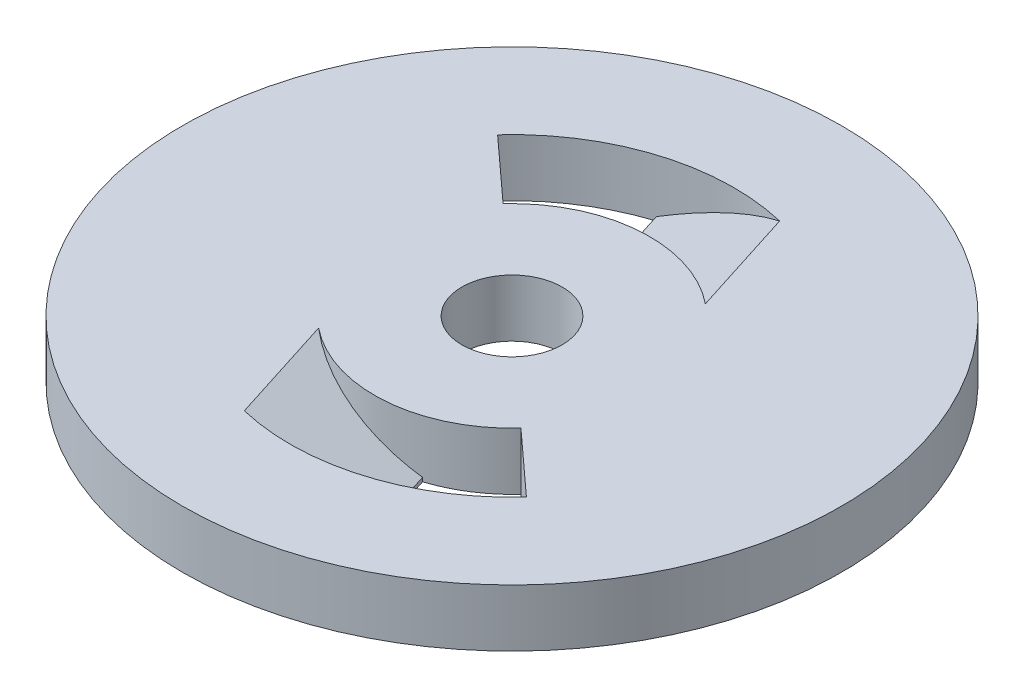
ISO-10303-21;
HEADER;
FILE_DESCRIPTION(('STEP AP214'),'2;1');
FILE_NAME('part.step','',(''),(''),'','','');
FILE_SCHEMA(('AUTOMOTIVE_DESIGN { 1 0 10303 214 1 1 1 1 }'));
ENDSEC;
DATA;
#1=APPLICATION_CONTEXT('core data for automotive mechanical design processes');
#2=APPLICATION_PROTOCOL_DEFINITION('international standard','automotive_design',2000,#1);
#3=PRODUCT_CONTEXT('',#1,'mechanical');
#4=PRODUCT('Part','Part','',(#3));
#5=PRODUCT_RELATED_PRODUCT_CATEGORY('part','',(#4));
#6=PRODUCT_DEFINITION_FORMATION('','',#4);
#7=PRODUCT_DEFINITION_CONTEXT('part definition',#1,'design');
#8=PRODUCT_DEFINITION('design','',#6,#7);
#9=PRODUCT_DEFINITION_SHAPE('','',#8);
#10=(LENGTH_UNIT() NAMED_UNIT(*) SI_UNIT(.MILLI.,.METRE.));
#11=(NAMED_UNIT(*) PLANE_ANGLE_UNIT() SI_UNIT($,.RADIAN.));
#12=(NAMED_UNIT(*) SI_UNIT($,.STERADIAN.) SOLID_ANGLE_UNIT());
#13=UNCERTAINTY_MEASURE_WITH_UNIT(LENGTH_MEASURE(1.E-05),#10,'distance_accuracy_value','');
#14=(GEOMETRIC_REPRESENTATION_CONTEXT(3) GLOBAL_UNCERTAINTY_ASSIGNED_CONTEXT((#13)) GLOBAL_UNIT_ASSIGNED_CONTEXT((#10,
#11,#12)) REPRESENTATION_CONTEXT('',''));
#15=CARTESIAN_POINT('',(0.,0.,0.));
#16=DIRECTION('',(0.,0.,1.));
#17=DIRECTION('',(1.,0.,0.));
#18=AXIS2_PLACEMENT_3D('',#15,#16,#17);
#19=CARTESIAN_POINT('',(0.,2.,0.));
#20=DIRECTION('',(0.,1.,0.));
#21=DIRECTION('',(0.,0.,1.));
#22=AXIS2_PLACEMENT_3D('',#19,#20,#21);
#23=PLANE('',#22);
#24=CARTESIAN_POINT('',(0.,2.,0.));
#25=DIRECTION('',(0.,1.,0.));
#26=DIRECTION('',(0.,0.,-1.));
#27=AXIS2_PLACEMENT_3D('',#24,#25,#26);
#28=CIRCLE('',#27,7.75);
#29=CARTESIAN_POINT('',(1.8019438699311,2.,-7.53760560719502));
#30=VERTEX_POINT('',#29);
#31=CARTESIAN_POINT('',(-5.7255934718888,2.,-5.22303354332177));
#32=VERTEX_POINT('',#31);
#33=EDGE_CURVE('E124',#30,#32,#28,.T.);
#34=ORIENTED_EDGE('',*,*,#33,.F.);
#35=DIRECTION('',(0.302837758288679,0.,0.953042125068293));
#36=VECTOR('',#35,1.);
#37=CARTESIAN_POINT('',(2.35854726048755,2.,-5.78595323348253));
#38=LINE('',#37,#36);
#39=CARTESIAN_POINT('',(3.00864912699651,2.,-3.74005754375827));
#40=VERTEX_POINT('',#39);
#41=EDGE_CURVE('E227',#30,#40,#38,.T.);
#42=ORIENTED_EDGE('',*,*,#41,.T.);
#43=CARTESIAN_POINT('',(0.,2.,0.));
#44=DIRECTION('',(0.,-1.,0.));
#45=DIRECTION('',(0.,0.,-1.));
#46=AXIS2_PLACEMENT_3D('',#43,#44,#45);
#47=CIRCLE('',#46,4.8);
#48=CARTESIAN_POINT('',(-3.54617402129887,2.,-3.23491109779929));
#49=VERTEX_POINT('',#48);
#50=EDGE_CURVE('E145',#49,#40,#47,.T.);
#51=ORIENTED_EDGE('',*,*,#50,.F.);
#52=DIRECTION('',(0.738786254437265,0.,0.673939812041519));
#53=VECTOR('',#52,1.);
#54=CARTESIAN_POINT('',(-3.54617402129887,2.,-3.23491109779929));
#55=LINE('',#54,#53);
#56=EDGE_CURVE('E148',#32,#49,#55,.T.);
#57=ORIENTED_EDGE('',*,*,#56,.F.);
#58=EDGE_LOOP('',(#34,#42,#51,#57));
#59=FACE_BOUND('',#58,.T.);
#60=CARTESIAN_POINT('',(0.,2.,0.));
#61=DIRECTION('',(0.,1.,0.));
#62=DIRECTION('',(0.,0.,1.));
#63=AXIS2_PLACEMENT_3D('',#60,#61,#62);
#64=CIRCLE('',#63,7.75);
#65=CARTESIAN_POINT('',(-1.8019438699311,2.,7.53760560719502));
#66=VERTEX_POINT('',#65);
#67=CARTESIAN_POINT('',(5.7255934718888,2.,5.22303354332177));
#68=VERTEX_POINT('',#67);
#69=EDGE_CURVE('E55',#66,#68,#64,.T.);
#70=ORIENTED_EDGE('',*,*,#69,.F.);
#71=DIRECTION('',(-0.302837758288679,0.,-0.953042125068293));
#72=VECTOR('',#71,1.);
#73=CARTESIAN_POINT('',(-2.35854726048754,2.,5.78595323348253));
#74=LINE('',#73,#72);
#75=CARTESIAN_POINT('',(-3.0086491269965,2.,3.74005754375827));
#76=VERTEX_POINT('',#75);
#77=EDGE_CURVE('E241',#66,#76,#74,.T.);
#78=ORIENTED_EDGE('',*,*,#77,.T.);
#79=CARTESIAN_POINT('',(0.,2.,0.));
#80=DIRECTION('',(0.,-1.,0.));
#81=DIRECTION('',(0.,0.,1.));
#82=AXIS2_PLACEMENT_3D('',#79,#80,#81);
#83=CIRCLE('',#82,4.8);
#84=CARTESIAN_POINT('',(3.54617402129887,2.,3.23491109779929));
#85=VERTEX_POINT('',#84);
#86=EDGE_CURVE('E62',#85,#76,#83,.T.);
#87=ORIENTED_EDGE('',*,*,#86,.F.);
#88=DIRECTION('',(-0.738786254437265,0.,-0.673939812041519));
#89=VECTOR('',#88,1.);
#90=CARTESIAN_POINT('',(5.7255934718888,2.,5.22303354332177));
#91=LINE('',#90,#89);
#92=EDGE_CURVE('E189',#68,#85,#91,.T.);
#93=ORIENTED_EDGE('',*,*,#92,.F.);
#94=EDGE_LOOP('',(#70,#78,#87,#93));
#95=FACE_BOUND('',#94,.T.);
#96=CARTESIAN_POINT('',(0.,2.,0.));
#97=DIRECTION('',(0.,1.,0.));
#98=DIRECTION('',(0.,0.,1.));
#99=AXIS2_PLACEMENT_3D('',#96,#97,#98);
#100=CIRCLE('',#99,11.5);
#101=CARTESIAN_POINT('',(0.,2.,11.5));
#102=VERTEX_POINT('',#101);
#103=EDGE_CURVE('E216',#102,#102,#100,.T.);
#104=ORIENTED_EDGE('',*,*,#103,.T.);
#105=EDGE_LOOP('',(#104));
#106=FACE_BOUND('',#105,.T.);
#107=CARTESIAN_POINT('',(0.,2.,0.));
#108=DIRECTION('',(0.,1.,0.));
#109=DIRECTION('',(0.,0.,1.));
#110=AXIS2_PLACEMENT_3D('',#107,#108,#109);
#111=CIRCLE('',#110,1.75);
#112=CARTESIAN_POINT('',(0.,2.,1.75));
#113=VERTEX_POINT('',#112);
#114=EDGE_CURVE('E208',#113,#113,#111,.T.);
#115=ORIENTED_EDGE('',*,*,#114,.F.);
#116=EDGE_LOOP('',(#115));
#117=FACE_BOUND('',#116,.T.);
#118=ADVANCED_FACE('F39',(#59,#95,#106,#117),#23,.T.);
#119=CARTESIAN_POINT('',(0.,0.,0.));
#120=DIRECTION('',(0.,1.,0.));
#121=DIRECTION('',(0.,0.,1.));
#122=AXIS2_PLACEMENT_3D('',#119,#120,#121);
#123=PLANE('',#122);
#124=DIRECTION('',(-0.302837758288678,0.,-0.953042125068293));
#125=VECTOR('',#124,1.);
#126=CARTESIAN_POINT('',(-1.45362123978566,0.,-4.57460220032781));
#127=LINE('',#126,#125);
#128=CARTESIAN_POINT('',(-1.45362123978565,0.,-4.57460220032781));
#129=VERTEX_POINT('',#128);
#130=CARTESIAN_POINT('',(-2.34699262673726,0.,-7.38607646927927));
#131=VERTEX_POINT('',#130);
#132=EDGE_CURVE('E130',#129,#131,#127,.T.);
#133=ORIENTED_EDGE('',*,*,#132,.T.);
#134=CARTESIAN_POINT('',(0.,0.,0.));
#135=DIRECTION('',(0.,1.,0.));
#136=DIRECTION('',(0.,0.,-1.));
#137=AXIS2_PLACEMENT_3D('',#134,#135,#136);
#138=CIRCLE('',#137,7.75);
#139=CARTESIAN_POINT('',(-5.7255934718888,0.,-5.22303354332177));
#140=VERTEX_POINT('',#139);
#141=EDGE_CURVE('E121',#131,#140,#138,.T.);
#142=ORIENTED_EDGE('',*,*,#141,.T.);
#143=DIRECTION('',(0.738786254437265,0.,0.673939812041519));
#144=VECTOR('',#143,1.);
#145=CARTESIAN_POINT('',(-3.54617402129887,0.,-3.23491109779929));
#146=LINE('',#145,#144);
#147=CARTESIAN_POINT('',(-3.54617402129887,0.,-3.23491109779929));
#148=VERTEX_POINT('',#147);
#149=EDGE_CURVE('E134',#140,#148,#146,.T.);
#150=ORIENTED_EDGE('',*,*,#149,.T.);
#151=CARTESIAN_POINT('',(0.,0.,0.));
#152=DIRECTION('',(0.,-1.,0.));
#153=DIRECTION('',(0.,0.,-1.));
#154=AXIS2_PLACEMENT_3D('',#151,#152,#153);
#155=CIRCLE('',#154,4.8);
#156=EDGE_CURVE('E139',#148,#129,#155,.T.);
#157=ORIENTED_EDGE('',*,*,#156,.T.);
#158=EDGE_LOOP('',(#133,#142,#150,#157));
#159=FACE_BOUND('',#158,.T.);
#160=DIRECTION('',(0.302837758288679,0.,0.953042125068293));
#161=VECTOR('',#160,1.);
#162=CARTESIAN_POINT('',(2.34699262673726,0.,7.38607646927927));
#163=LINE('',#162,#161);
#164=CARTESIAN_POINT('',(1.45362123978566,0.,4.57460220032781));
#165=VERTEX_POINT('',#164);
#166=CARTESIAN_POINT('',(2.34699262673726,0.,7.38607646927927));
#167=VERTEX_POINT('',#166);
#168=EDGE_CURVE('E182',#165,#167,#163,.T.);
#169=ORIENTED_EDGE('',*,*,#168,.T.);
#170=CARTESIAN_POINT('',(0.,0.,0.));
#171=DIRECTION('',(0.,1.,0.));
#172=DIRECTION('',(0.,0.,1.));
#173=AXIS2_PLACEMENT_3D('',#170,#171,#172);
#174=CIRCLE('',#173,7.75);
#175=CARTESIAN_POINT('',(5.7255934718888,0.,5.22303354332177));
#176=VERTEX_POINT('',#175);
#177=EDGE_CURVE('E170',#167,#176,#174,.T.);
#178=ORIENTED_EDGE('',*,*,#177,.T.);
#179=DIRECTION('',(-0.738786254437265,0.,-0.673939812041519));
#180=VECTOR('',#179,1.);
#181=CARTESIAN_POINT('',(5.7255934718888,0.,5.22303354332177));
#182=LINE('',#181,#180);
#183=CARTESIAN_POINT('',(3.54617402129887,0.,3.23491109779929));
#184=VERTEX_POINT('',#183);
#185=EDGE_CURVE('E174',#176,#184,#182,.T.);
#186=ORIENTED_EDGE('',*,*,#185,.T.);
#187=CARTESIAN_POINT('',(0.,0.,0.));
#188=DIRECTION('',(0.,-1.,0.));
#189=DIRECTION('',(0.,0.,1.));
#190=AXIS2_PLACEMENT_3D('',#187,#188,#189);
#191=CIRCLE('',#190,4.8);
#192=EDGE_CURVE('E178',#184,#165,#191,.T.);
#193=ORIENTED_EDGE('',*,*,#192,.T.);
#194=EDGE_LOOP('',(#169,#178,#186,#193));
#195=FACE_BOUND('',#194,.T.);
#196=CARTESIAN_POINT('',(0.,0.,0.));
#197=DIRECTION('',(0.,1.,0.));
#198=DIRECTION('',(0.,0.,1.));
#199=AXIS2_PLACEMENT_3D('',#196,#197,#198);
#200=CIRCLE('',#199,11.5);
#201=CARTESIAN_POINT('',(0.,0.,11.5));
#202=VERTEX_POINT('',#201);
#203=EDGE_CURVE('E212',#202,#202,#200,.T.);
#204=ORIENTED_EDGE('',*,*,#203,.F.);
#205=EDGE_LOOP('',(#204));
#206=FACE_BOUND('',#205,.T.);
#207=CARTESIAN_POINT('',(0.,0.,0.));
#208=DIRECTION('',(0.,1.,0.));
#209=DIRECTION('',(0.,0.,1.));
#210=AXIS2_PLACEMENT_3D('',#207,#208,#209);
#211=CIRCLE('',#210,1.75);
#212=CARTESIAN_POINT('',(0.,0.,1.75));
#213=VERTEX_POINT('',#212);
#214=EDGE_CURVE('E163',#213,#213,#211,.T.);
#215=ORIENTED_EDGE('',*,*,#214,.T.);
#216=EDGE_LOOP('',(#215));
#217=FACE_BOUND('',#216,.T.);
#218=ADVANCED_FACE('F141',(#159,#195,#206,#217),#123,.F.);
#219=CARTESIAN_POINT('',(0.,2.,0.));
#220=DIRECTION('',(0.,-1.,0.));
#221=DIRECTION('',(0.,0.,-1.));
#222=AXIS2_PLACEMENT_3D('',#219,#220,#221);
#223=CYLINDRICAL_SURFACE('',#222,11.5);
#224=ORIENTED_EDGE('',*,*,#103,.F.);
#225=EDGE_LOOP('',(#224));
#226=FACE_BOUND('',#225,.T.);
#227=ORIENTED_EDGE('',*,*,#203,.T.);
#228=EDGE_LOOP('',(#227));
#229=FACE_BOUND('',#228,.T.);
#230=ADVANCED_FACE('F275',(#226,#229),#223,.T.);
#231=CARTESIAN_POINT('',(0.,2.,0.));
#232=DIRECTION('',(0.,-1.,0.));
#233=DIRECTION('',(0.,0.,-1.));
#234=AXIS2_PLACEMENT_3D('',#231,#232,#233);
#235=CYLINDRICAL_SURFACE('',#234,1.75);
#236=ORIENTED_EDGE('',*,*,#114,.T.);
#237=EDGE_LOOP('',(#236));
#238=FACE_BOUND('',#237,.T.);
#239=ORIENTED_EDGE('',*,*,#214,.F.);
#240=EDGE_LOOP('',(#239));
#241=FACE_BOUND('',#240,.T.);
#242=ADVANCED_FACE('F278',(#238,#241),#235,.F.);
#243=CARTESIAN_POINT('',(0.,0.,0.));
#244=DIRECTION('',(0.,1.,0.));
#245=DIRECTION('',(0.,0.,1.));
#246=AXIS2_PLACEMENT_3D('',#243,#244,#245);
#247=CYLINDRICAL_SURFACE('',#246,7.75);
#248=ORIENTED_EDGE('',*,*,#69,.T.);
#249=DIRECTION('',(0.,1.,0.));
#250=VECTOR('',#249,1.);
#251=CARTESIAN_POINT('',(5.7255934718888,0.,5.22303354332177));
#252=LINE('',#251,#250);
#253=EDGE_CURVE('E186',#176,#68,#252,.T.);
#254=ORIENTED_EDGE('',*,*,#253,.F.);
#255=ORIENTED_EDGE('',*,*,#177,.F.);
#256=DIRECTION('',(0.,1.,0.));
#257=VECTOR('',#256,1.);
#258=CARTESIAN_POINT('',(2.34699262673726,0.,7.38607646927927));
#259=LINE('',#258,#257);
#260=CARTESIAN_POINT('',(2.34699262673726,0.134769367380005,7.38607646927927));
#261=VERTEX_POINT('',#260);
#262=EDGE_CURVE('E157',#167,#261,#259,.T.);
#263=ORIENTED_EDGE('',*,*,#262,.T.);
#264=CARTESIAN_POINT('',(0.,0.134769367380004,0.));
#265=DIRECTION('',(0.402773006262022,0.906307787036651,-0.127984766997411));
#266=DIRECTION('',(-0.863749499323352,0.422618261740697,0.274464218545753));
#267=AXIS2_PLACEMENT_3D('',#264,#265,#266);
#268=ELLIPSE('',#267,8.5511788719593,7.75);
#269=EDGE_CURVE('E48',#261,#66,#268,.F.);
#270=ORIENTED_EDGE('',*,*,#269,.T.);
#271=EDGE_LOOP('',(#248,#254,#255,#263,#270));
#272=FACE_BOUND('',#271,.T.);
#273=ADVANCED_FACE('F246',(#272),#247,.F.);
#274=CARTESIAN_POINT('',(2.34699262673726,0.,7.38607646927927));
#275=DIRECTION('',(-0.953042125068293,0.,0.302837758288679));
#276=DIRECTION('',(0.302837758288679,0.,0.953042125068293));
#277=AXIS2_PLACEMENT_3D('',#274,#275,#276);
#278=PLANE('',#277);
#279=DIRECTION('',(0.,1.,0.));
#280=VECTOR('',#279,1.);
#281=CARTESIAN_POINT('',(1.45362123978566,0.,4.57460220032781));
#282=LINE('',#281,#280);
#283=CARTESIAN_POINT('',(1.45362123978566,0.134769367380005,4.57460220032781));
#284=VERTEX_POINT('',#283);
#285=EDGE_CURVE('E198',#165,#284,#282,.T.);
#286=ORIENTED_EDGE('',*,*,#285,.T.);
#287=DIRECTION('',(0.302837758288679,0.,0.953042125068293));
#288=VECTOR('',#287,1.);
#289=CARTESIAN_POINT('',(2.34699262673726,0.134769367380005,7.38607646927927));
#290=LINE('',#289,#288);
#291=EDGE_CURVE('E237',#284,#261,#290,.T.);
#292=ORIENTED_EDGE('',*,*,#291,.T.);
#293=ORIENTED_EDGE('',*,*,#262,.F.);
#294=ORIENTED_EDGE('',*,*,#168,.F.);
#295=EDGE_LOOP('',(#286,#292,#293,#294));
#296=FACE_BOUND('',#295,.T.);
#297=ADVANCED_FACE('F259',(#296),#278,.F.);
#298=CARTESIAN_POINT('',(0.,0.,0.));
#299=DIRECTION('',(0.,1.,0.));
#300=DIRECTION('',(0.,0.,1.));
#301=AXIS2_PLACEMENT_3D('',#298,#299,#300);
#302=CYLINDRICAL_SURFACE('',#301,4.8);
#303=ORIENTED_EDGE('',*,*,#86,.T.);
#304=CARTESIAN_POINT('',(0.,0.134769367380004,0.));
#305=DIRECTION('',(0.402773006262022,0.906307787036651,-0.127984766997411));
#306=DIRECTION('',(-0.863749499323352,0.422618261740697,0.274464218545753));
#307=AXIS2_PLACEMENT_3D('',#304,#305,#306);
#308=ELLIPSE('',#307,5.29621401101995,4.8);
#309=EDGE_CURVE('E11',#76,#284,#308,.T.);
#310=ORIENTED_EDGE('',*,*,#309,.T.);
#311=ORIENTED_EDGE('',*,*,#285,.F.);
#312=ORIENTED_EDGE('',*,*,#192,.F.);
#313=DIRECTION('',(0.,1.,0.));
#314=VECTOR('',#313,1.);
#315=CARTESIAN_POINT('',(3.54617402129887,0.,3.23491109779929));
#316=LINE('',#315,#314);
#317=EDGE_CURVE('E202',#184,#85,#316,.T.);
#318=ORIENTED_EDGE('',*,*,#317,.T.);
#319=EDGE_LOOP('',(#303,#310,#311,#312,#318));
#320=FACE_BOUND('',#319,.T.);
#321=ADVANCED_FACE('F260',(#320),#302,.T.);
#322=CARTESIAN_POINT('',(5.7255934718888,0.,5.22303354332177));
#323=DIRECTION('',(0.673939812041519,0.,-0.738786254437265));
#324=DIRECTION('',(-0.738786254437265,0.,-0.673939812041519));
#325=AXIS2_PLACEMENT_3D('',#322,#323,#324);
#326=PLANE('',#325);
#327=ORIENTED_EDGE('',*,*,#92,.T.);
#328=ORIENTED_EDGE('',*,*,#317,.F.);
#329=ORIENTED_EDGE('',*,*,#185,.F.);
#330=ORIENTED_EDGE('',*,*,#253,.T.);
#331=EDGE_LOOP('',(#327,#328,#329,#330));
#332=FACE_BOUND('',#331,.T.);
#333=ADVANCED_FACE('F254',(#332),#326,.F.);
#334=CARTESIAN_POINT('',(0.,0.,0.));
#335=DIRECTION('',(0.,1.,0.));
#336=DIRECTION('',(0.,0.,1.));
#337=AXIS2_PLACEMENT_3D('',#334,#335,#336);
#338=CYLINDRICAL_SURFACE('',#337,7.75);
#339=ORIENTED_EDGE('',*,*,#33,.T.);
#340=DIRECTION('',(0.,1.,0.));
#341=VECTOR('',#340,1.);
#342=CARTESIAN_POINT('',(-5.7255934718888,0.,-5.22303354332177));
#343=LINE('',#342,#341);
#344=EDGE_CURVE('E116',#140,#32,#343,.T.);
#345=ORIENTED_EDGE('',*,*,#344,.F.);
#346=ORIENTED_EDGE('',*,*,#141,.F.);
#347=DIRECTION('',(0.,1.,0.));
#348=VECTOR('',#347,1.);
#349=CARTESIAN_POINT('',(-2.34699262673726,0.,-7.38607646927927));
#350=LINE('',#349,#348);
#351=CARTESIAN_POINT('',(-2.34699262673726,0.134769367380005,-7.38607646927927));
#352=VERTEX_POINT('',#351);
#353=EDGE_CURVE('E160',#131,#352,#350,.T.);
#354=ORIENTED_EDGE('',*,*,#353,.T.);
#355=CARTESIAN_POINT('',(0.,0.134769367380004,0.));
#356=DIRECTION('',(-0.402773006262022,0.906307787036651,0.127984766997411));
#357=DIRECTION('',(0.863749499323352,0.422618261740697,-0.274464218545752));
#358=AXIS2_PLACEMENT_3D('',#355,#356,#357);
#359=ELLIPSE('',#358,8.5511788719593,7.75);
#360=EDGE_CURVE('E231',#352,#30,#359,.F.);
#361=ORIENTED_EDGE('',*,*,#360,.T.);
#362=EDGE_LOOP('',(#339,#345,#346,#354,#361));
#363=FACE_BOUND('',#362,.T.);
#364=ADVANCED_FACE('F118',(#363),#338,.F.);
#365=CARTESIAN_POINT('',(-1.45362123978566,0.,-4.57460220032781));
#366=DIRECTION('',(0.953042125068293,0.,-0.302837758288679));
#367=DIRECTION('',(-0.302837758288679,0.,-0.953042125068293));
#368=AXIS2_PLACEMENT_3D('',#365,#366,#367);
#369=PLANE('',#368);
#370=DIRECTION('',(0.,1.,0.));
#371=VECTOR('',#370,1.);
#372=CARTESIAN_POINT('',(-1.45362123978565,0.,-4.57460220032781));
#373=LINE('',#372,#371);
#374=CARTESIAN_POINT('',(-1.45362123978565,0.134769367380005,-4.57460220032781));
#375=VERTEX_POINT('',#374);
#376=EDGE_CURVE('E164',#129,#375,#373,.T.);
#377=ORIENTED_EDGE('',*,*,#376,.T.);
#378=DIRECTION('',(-0.302837758288679,0.,-0.953042125068293));
#379=VECTOR('',#378,1.);
#380=CARTESIAN_POINT('',(-2.34699262673726,0.134769367380005,-7.38607646927927));
#381=LINE('',#380,#379);
#382=EDGE_CURVE('E220',#375,#352,#381,.T.);
#383=ORIENTED_EDGE('',*,*,#382,.T.);
#384=ORIENTED_EDGE('',*,*,#353,.F.);
#385=ORIENTED_EDGE('',*,*,#132,.F.);
#386=EDGE_LOOP('',(#377,#383,#384,#385));
#387=FACE_BOUND('',#386,.T.);
#388=ADVANCED_FACE('F298',(#387),#369,.F.);
#389=CARTESIAN_POINT('',(0.,0.,0.));
#390=DIRECTION('',(0.,1.,0.));
#391=DIRECTION('',(0.,0.,1.));
#392=AXIS2_PLACEMENT_3D('',#389,#390,#391);
#393=CYLINDRICAL_SURFACE('',#392,4.8);
#394=ORIENTED_EDGE('',*,*,#50,.T.);
#395=CARTESIAN_POINT('',(0.,0.134769367380004,0.));
#396=DIRECTION('',(-0.402773006262022,0.906307787036651,0.127984766997411));
#397=DIRECTION('',(0.863749499323352,0.422618261740697,-0.274464218545752));
#398=AXIS2_PLACEMENT_3D('',#395,#396,#397);
#399=ELLIPSE('',#398,5.29621401101995,4.8);
#400=EDGE_CURVE('E234',#40,#375,#399,.T.);
#401=ORIENTED_EDGE('',*,*,#400,.T.);
#402=ORIENTED_EDGE('',*,*,#376,.F.);
#403=ORIENTED_EDGE('',*,*,#156,.F.);
#404=DIRECTION('',(0.,1.,0.));
#405=VECTOR('',#404,1.);
#406=CARTESIAN_POINT('',(-3.54617402129887,0.,-3.23491109779929));
#407=LINE('',#406,#405);
#408=EDGE_CURVE('E129',#148,#49,#407,.T.);
#409=ORIENTED_EDGE('',*,*,#408,.T.);
#410=EDGE_LOOP('',(#394,#401,#402,#403,#409));
#411=FACE_BOUND('',#410,.T.);
#412=ADVANCED_FACE('F290',(#411),#393,.T.);
#413=CARTESIAN_POINT('',(-3.54617402129887,0.,-3.23491109779929));
#414=DIRECTION('',(-0.673939812041519,0.,0.738786254437265));
#415=DIRECTION('',(0.738786254437265,0.,0.673939812041519));
#416=AXIS2_PLACEMENT_3D('',#413,#414,#415);
#417=PLANE('',#416);
#418=ORIENTED_EDGE('',*,*,#56,.T.);
#419=ORIENTED_EDGE('',*,*,#408,.F.);
#420=ORIENTED_EDGE('',*,*,#149,.F.);
#421=ORIENTED_EDGE('',*,*,#344,.T.);
#422=EDGE_LOOP('',(#418,#419,#420,#421));
#423=FACE_BOUND('',#422,.T.);
#424=ADVANCED_FACE('F135',(#423),#417,.F.);
#425=CARTESIAN_POINT('',(-1.45362123978566,0.134769367380005,-4.57460220032781));
#426=DIRECTION('',(-0.402773006262022,0.906307787036651,0.127984766997411));
#427=DIRECTION('',(0.302837758288679,0.,0.953042125068293));
#428=AXIS2_PLACEMENT_3D('',#425,#426,#427);
#429=PLANE('',#428);
#430=ORIENTED_EDGE('',*,*,#400,.F.);
#431=ORIENTED_EDGE('',*,*,#41,.F.);
#432=ORIENTED_EDGE('',*,*,#360,.F.);
#433=ORIENTED_EDGE('',*,*,#382,.F.);
#434=EDGE_LOOP('',(#430,#431,#432,#433));
#435=FACE_BOUND('',#434,.T.);
#436=ADVANCED_FACE('F283',(#435),#429,.T.);
#437=CARTESIAN_POINT('',(2.34699262673726,0.134769367380005,7.38607646927927));
#438=DIRECTION('',(0.402773006262022,0.906307787036651,-0.127984766997411));
#439=DIRECTION('',(-0.302837758288679,0.,-0.953042125068293));
#440=AXIS2_PLACEMENT_3D('',#437,#438,#439);
#441=PLANE('',#440);
#442=ORIENTED_EDGE('',*,*,#309,.F.);
#443=ORIENTED_EDGE('',*,*,#77,.F.);
#444=ORIENTED_EDGE('',*,*,#269,.F.);
#445=ORIENTED_EDGE('',*,*,#291,.F.);
#446=EDGE_LOOP('',(#442,#443,#444,#445));
#447=FACE_BOUND('',#446,.T.);
#448=ADVANCED_FACE('F41',(#447),#441,.T.);
#449=CLOSED_SHELL('',(#118,#218,#230,#242,#273,#297,#321,#333,#364,#388,#412,#424,#436,#448));
#450=MANIFOLD_SOLID_BREP('B2',#449);
#451=ADVANCED_BREP_SHAPE_REPRESENTATION('',(#18,#450),#14);
#452=SHAPE_DEFINITION_REPRESENTATION(#9,#451);
ENDSEC;
END-ISO-10303-21;
